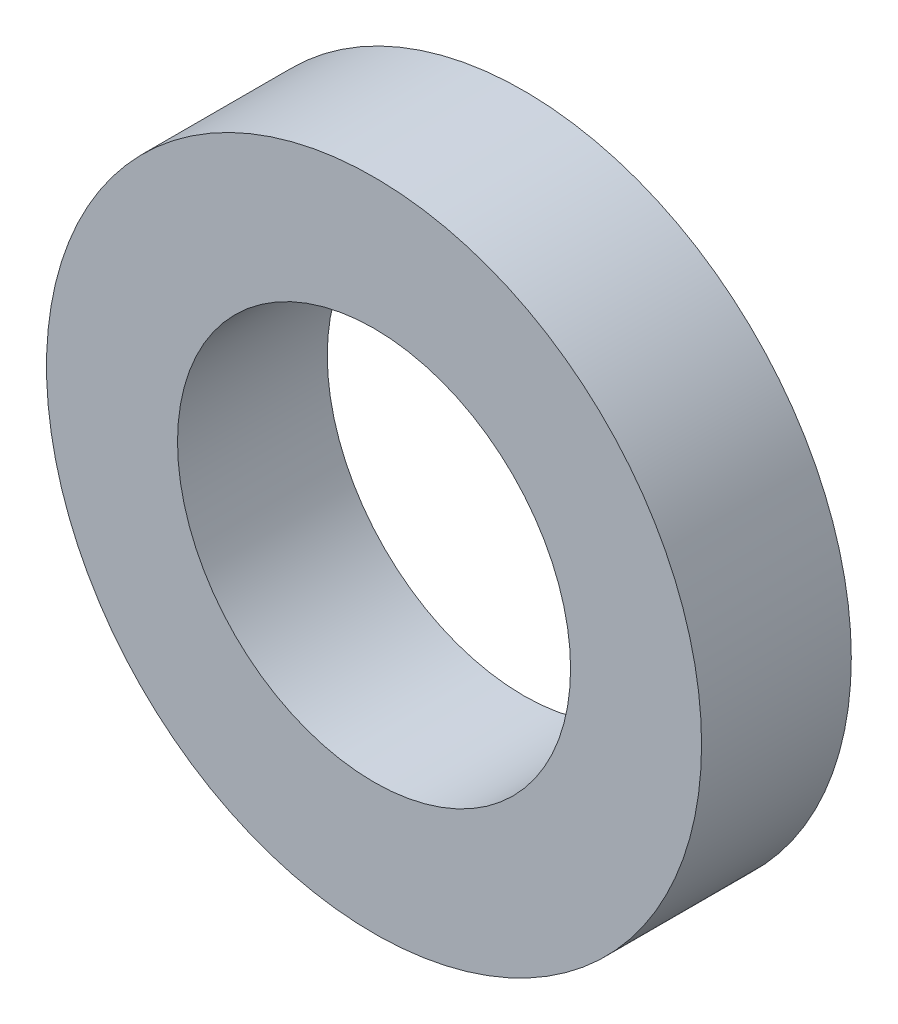
ISO-10303-21;
HEADER;
FILE_DESCRIPTION(('STEP AP214'),'2;1');
FILE_NAME('part.step','',(''),(''),'','','');
FILE_SCHEMA(('AUTOMOTIVE_DESIGN { 1 0 10303 214 1 1 1 1 }'));
ENDSEC;
DATA;
#1=APPLICATION_CONTEXT('core data for automotive mechanical design processes');
#2=APPLICATION_PROTOCOL_DEFINITION('international standard','automotive_design',2000,#1);
#3=PRODUCT_CONTEXT('',#1,'mechanical');
#4=PRODUCT('Part','Part','',(#3));
#5=PRODUCT_RELATED_PRODUCT_CATEGORY('part','',(#4));
#6=PRODUCT_DEFINITION_FORMATION('','',#4);
#7=PRODUCT_DEFINITION_CONTEXT('part definition',#1,'design');
#8=PRODUCT_DEFINITION('design','',#6,#7);
#9=PRODUCT_DEFINITION_SHAPE('','',#8);
#10=(LENGTH_UNIT() NAMED_UNIT(*) SI_UNIT(.MILLI.,.METRE.));
#11=(NAMED_UNIT(*) PLANE_ANGLE_UNIT() SI_UNIT($,.RADIAN.));
#12=(NAMED_UNIT(*) SI_UNIT($,.STERADIAN.) SOLID_ANGLE_UNIT());
#13=UNCERTAINTY_MEASURE_WITH_UNIT(LENGTH_MEASURE(1.E-05),#10,'distance_accuracy_value','');
#14=(GEOMETRIC_REPRESENTATION_CONTEXT(3) GLOBAL_UNCERTAINTY_ASSIGNED_CONTEXT((#13)) GLOBAL_UNIT_ASSIGNED_CONTEXT((#10,
#11,#12)) REPRESENTATION_CONTEXT('',''));
#15=CARTESIAN_POINT('',(0.,0.,0.));
#16=DIRECTION('',(0.,0.,1.));
#17=DIRECTION('',(1.,0.,0.));
#18=AXIS2_PLACEMENT_3D('',#15,#16,#17);
#19=CARTESIAN_POINT('',(0.,0.,0.4));
#20=DIRECTION('',(0.,0.,1.));
#21=DIRECTION('',(1.,0.,0.));
#22=AXIS2_PLACEMENT_3D('',#19,#20,#21);
#23=PLANE('',#22);
#24=CARTESIAN_POINT('',(0.,0.,0.4));
#25=DIRECTION('',(0.,0.,1.));
#26=DIRECTION('',(1.,0.,0.));
#27=AXIS2_PLACEMENT_3D('',#24,#25,#26);
#28=CIRCLE('',#27,1.75);
#29=CARTESIAN_POINT('',(1.75,0.,0.4));
#30=VERTEX_POINT('',#29);
#31=EDGE_CURVE('E10',#30,#30,#28,.T.);
#32=ORIENTED_EDGE('',*,*,#31,.T.);
#33=EDGE_LOOP('',(#32));
#34=FACE_BOUND('',#33,.T.);
#35=CARTESIAN_POINT('',(0.,0.,0.4));
#36=DIRECTION('',(0.,0.,1.));
#37=DIRECTION('',(1.,0.,0.));
#38=AXIS2_PLACEMENT_3D('',#35,#36,#37);
#39=CIRCLE('',#38,1.05);
#40=CARTESIAN_POINT('',(1.05,0.,0.4));
#41=VERTEX_POINT('',#40);
#42=EDGE_CURVE('E45',#41,#41,#39,.T.);
#43=ORIENTED_EDGE('',*,*,#42,.F.);
#44=EDGE_LOOP('',(#43));
#45=FACE_BOUND('',#44,.T.);
#46=ADVANCED_FACE('F34',(#34,#45),#23,.T.);
#47=CARTESIAN_POINT('',(0.,0.,-0.4));
#48=DIRECTION('',(0.,0.,1.));
#49=DIRECTION('',(1.,0.,0.));
#50=AXIS2_PLACEMENT_3D('',#47,#48,#49);
#51=PLANE('',#50);
#52=CARTESIAN_POINT('',(0.,0.,-0.4));
#53=DIRECTION('',(0.,0.,1.));
#54=DIRECTION('',(1.,0.,0.));
#55=AXIS2_PLACEMENT_3D('',#52,#53,#54);
#56=CIRCLE('',#55,1.75);
#57=CARTESIAN_POINT('',(1.75,0.,-0.4));
#58=VERTEX_POINT('',#57);
#59=EDGE_CURVE('E38',#58,#58,#56,.T.);
#60=ORIENTED_EDGE('',*,*,#59,.F.);
#61=EDGE_LOOP('',(#60));
#62=FACE_BOUND('',#61,.T.);
#63=CARTESIAN_POINT('',(0.,0.,-0.4));
#64=DIRECTION('',(0.,0.,1.));
#65=DIRECTION('',(1.,0.,0.));
#66=AXIS2_PLACEMENT_3D('',#63,#64,#65);
#67=CIRCLE('',#66,1.05);
#68=CARTESIAN_POINT('',(1.05,0.,-0.4));
#69=VERTEX_POINT('',#68);
#70=EDGE_CURVE('E47',#69,#69,#67,.T.);
#71=ORIENTED_EDGE('',*,*,#70,.T.);
#72=EDGE_LOOP('',(#71));
#73=FACE_BOUND('',#72,.T.);
#74=ADVANCED_FACE('F57',(#62,#73),#51,.F.);
#75=CARTESIAN_POINT('',(0.,0.,0.4));
#76=DIRECTION('',(0.,0.,-1.));
#77=DIRECTION('',(-1.,0.,0.));
#78=AXIS2_PLACEMENT_3D('',#75,#76,#77);
#79=CYLINDRICAL_SURFACE('',#78,1.75);
#80=ORIENTED_EDGE('',*,*,#31,.F.);
#81=EDGE_LOOP('',(#80));
#82=FACE_BOUND('',#81,.T.);
#83=ORIENTED_EDGE('',*,*,#59,.T.);
#84=EDGE_LOOP('',(#83));
#85=FACE_BOUND('',#84,.T.);
#86=ADVANCED_FACE('F36',(#82,#85),#79,.T.);
#87=CARTESIAN_POINT('',(0.,0.,0.4));
#88=DIRECTION('',(0.,0.,-1.));
#89=DIRECTION('',(-1.,0.,0.));
#90=AXIS2_PLACEMENT_3D('',#87,#88,#89);
#91=CYLINDRICAL_SURFACE('',#90,1.05);
#92=ORIENTED_EDGE('',*,*,#42,.T.);
#93=EDGE_LOOP('',(#92));
#94=FACE_BOUND('',#93,.T.);
#95=ORIENTED_EDGE('',*,*,#70,.F.);
#96=EDGE_LOOP('',(#95));
#97=FACE_BOUND('',#96,.T.);
#98=ADVANCED_FACE('F53',(#94,#97),#91,.F.);
#99=CLOSED_SHELL('',(#46,#74,#86,#98));
#100=MANIFOLD_SOLID_BREP('B2',#99);
#101=ADVANCED_BREP_SHAPE_REPRESENTATION('',(#18,#100),#14);
#102=SHAPE_DEFINITION_REPRESENTATION(#9,#101);
ENDSEC;
END-ISO-10303-21;
